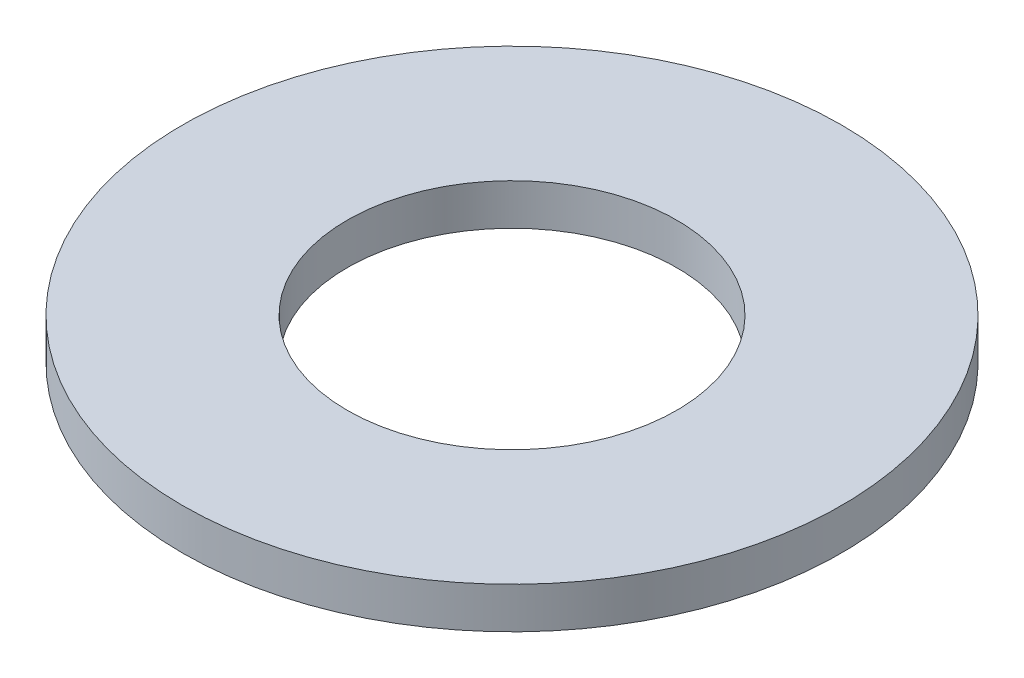
ISO-10303-21;
HEADER;
FILE_DESCRIPTION(('STEP AP214'),'2;1');
FILE_NAME('part.step','',(''),(''),'','','');
FILE_SCHEMA(('AUTOMOTIVE_DESIGN { 1 0 10303 214 1 1 1 1 }'));
ENDSEC;
DATA;
#1=APPLICATION_CONTEXT('core data for automotive mechanical design processes');
#2=APPLICATION_PROTOCOL_DEFINITION('international standard','automotive_design',2000,#1);
#3=PRODUCT_CONTEXT('',#1,'mechanical');
#4=PRODUCT('Part','Part','',(#3));
#5=PRODUCT_RELATED_PRODUCT_CATEGORY('part','',(#4));
#6=PRODUCT_DEFINITION_FORMATION('','',#4);
#7=PRODUCT_DEFINITION_CONTEXT('part definition',#1,'design');
#8=PRODUCT_DEFINITION('design','',#6,#7);
#9=PRODUCT_DEFINITION_SHAPE('','',#8);
#10=(LENGTH_UNIT() NAMED_UNIT(*) SI_UNIT(.MILLI.,.METRE.));
#11=(NAMED_UNIT(*) PLANE_ANGLE_UNIT() SI_UNIT($,.RADIAN.));
#12=(NAMED_UNIT(*) SI_UNIT($,.STERADIAN.) SOLID_ANGLE_UNIT());
#13=UNCERTAINTY_MEASURE_WITH_UNIT(LENGTH_MEASURE(1.E-05),#10,'distance_accuracy_value','');
#14=(GEOMETRIC_REPRESENTATION_CONTEXT(3) GLOBAL_UNCERTAINTY_ASSIGNED_CONTEXT((#13)) GLOBAL_UNIT_ASSIGNED_CONTEXT((#10,
#11,#12)) REPRESENTATION_CONTEXT('',''));
#15=CARTESIAN_POINT('',(0.,0.,0.));
#16=DIRECTION('',(0.,0.,1.));
#17=DIRECTION('',(1.,0.,0.));
#18=AXIS2_PLACEMENT_3D('',#15,#16,#17);
#19=CARTESIAN_POINT('',(0.,0.25,0.));
#20=DIRECTION('',(0.,1.,0.));
#21=DIRECTION('',(0.,0.,1.));
#22=AXIS2_PLACEMENT_3D('',#19,#20,#21);
#23=PLANE('',#22);
#24=CARTESIAN_POINT('',(0.,0.25,0.));
#25=DIRECTION('',(0.,1.,0.));
#26=DIRECTION('',(0.,0.,1.));
#27=AXIS2_PLACEMENT_3D('',#24,#25,#26);
#28=CIRCLE('',#27,2.);
#29=CARTESIAN_POINT('',(0.,0.25,2.));
#30=VERTEX_POINT('',#29);
#31=EDGE_CURVE('E10',#30,#30,#28,.T.);
#32=ORIENTED_EDGE('',*,*,#31,.T.);
#33=EDGE_LOOP('',(#32));
#34=FACE_BOUND('',#33,.T.);
#35=CARTESIAN_POINT('',(0.,0.25,0.));
#36=DIRECTION('',(0.,1.,0.));
#37=DIRECTION('',(0.,0.,1.));
#38=AXIS2_PLACEMENT_3D('',#35,#36,#37);
#39=CIRCLE('',#38,1.);
#40=CARTESIAN_POINT('',(0.,0.25,1.));
#41=VERTEX_POINT('',#40);
#42=EDGE_CURVE('E50',#41,#41,#39,.T.);
#43=ORIENTED_EDGE('',*,*,#42,.F.);
#44=EDGE_LOOP('',(#43));
#45=FACE_BOUND('',#44,.T.);
#46=ADVANCED_FACE('F37',(#34,#45),#23,.T.);
#47=CARTESIAN_POINT('',(0.,0.,0.));
#48=DIRECTION('',(0.,1.,0.));
#49=DIRECTION('',(0.,0.,1.));
#50=AXIS2_PLACEMENT_3D('',#47,#48,#49);
#51=PLANE('',#50);
#52=CARTESIAN_POINT('',(0.,0.,0.));
#53=DIRECTION('',(0.,1.,0.));
#54=DIRECTION('',(0.,0.,1.));
#55=AXIS2_PLACEMENT_3D('',#52,#53,#54);
#56=CIRCLE('',#55,2.);
#57=CARTESIAN_POINT('',(0.,0.,2.));
#58=VERTEX_POINT('',#57);
#59=EDGE_CURVE('E41',#58,#58,#56,.T.);
#60=ORIENTED_EDGE('',*,*,#59,.F.);
#61=EDGE_LOOP('',(#60));
#62=FACE_BOUND('',#61,.T.);
#63=CARTESIAN_POINT('',(0.,0.,0.));
#64=DIRECTION('',(0.,1.,0.));
#65=DIRECTION('',(0.,0.,1.));
#66=AXIS2_PLACEMENT_3D('',#63,#64,#65);
#67=CIRCLE('',#66,1.);
#68=CARTESIAN_POINT('',(0.,0.,1.));
#69=VERTEX_POINT('',#68);
#70=EDGE_CURVE('E52',#69,#69,#67,.T.);
#71=ORIENTED_EDGE('',*,*,#70,.T.);
#72=EDGE_LOOP('',(#71));
#73=FACE_BOUND('',#72,.T.);
#74=ADVANCED_FACE('F64',(#62,#73),#51,.F.);
#75=CARTESIAN_POINT('',(0.,0.25,0.));
#76=DIRECTION('',(0.,-1.,0.));
#77=DIRECTION('',(0.,0.,-1.));
#78=AXIS2_PLACEMENT_3D('',#75,#76,#77);
#79=CYLINDRICAL_SURFACE('',#78,2.);
#80=ORIENTED_EDGE('',*,*,#31,.F.);
#81=EDGE_LOOP('',(#80));
#82=FACE_BOUND('',#81,.T.);
#83=ORIENTED_EDGE('',*,*,#59,.T.);
#84=EDGE_LOOP('',(#83));
#85=FACE_BOUND('',#84,.T.);
#86=ADVANCED_FACE('F39',(#82,#85),#79,.T.);
#87=CARTESIAN_POINT('',(0.,0.25,0.));
#88=DIRECTION('',(0.,-1.,0.));
#89=DIRECTION('',(0.,0.,-1.));
#90=AXIS2_PLACEMENT_3D('',#87,#88,#89);
#91=CYLINDRICAL_SURFACE('',#90,1.);
#92=ORIENTED_EDGE('',*,*,#42,.T.);
#93=EDGE_LOOP('',(#92));
#94=FACE_BOUND('',#93,.T.);
#95=ORIENTED_EDGE('',*,*,#70,.F.);
#96=EDGE_LOOP('',(#95));
#97=FACE_BOUND('',#96,.T.);
#98=ADVANCED_FACE('F60',(#94,#97),#91,.F.);
#99=CLOSED_SHELL('',(#46,#74,#86,#98));
#100=MANIFOLD_SOLID_BREP('B2',#99);
#101=ADVANCED_BREP_SHAPE_REPRESENTATION('',(#18,#100),#14);
#102=SHAPE_DEFINITION_REPRESENTATION(#9,#101);
ENDSEC;
END-ISO-10303-21;
